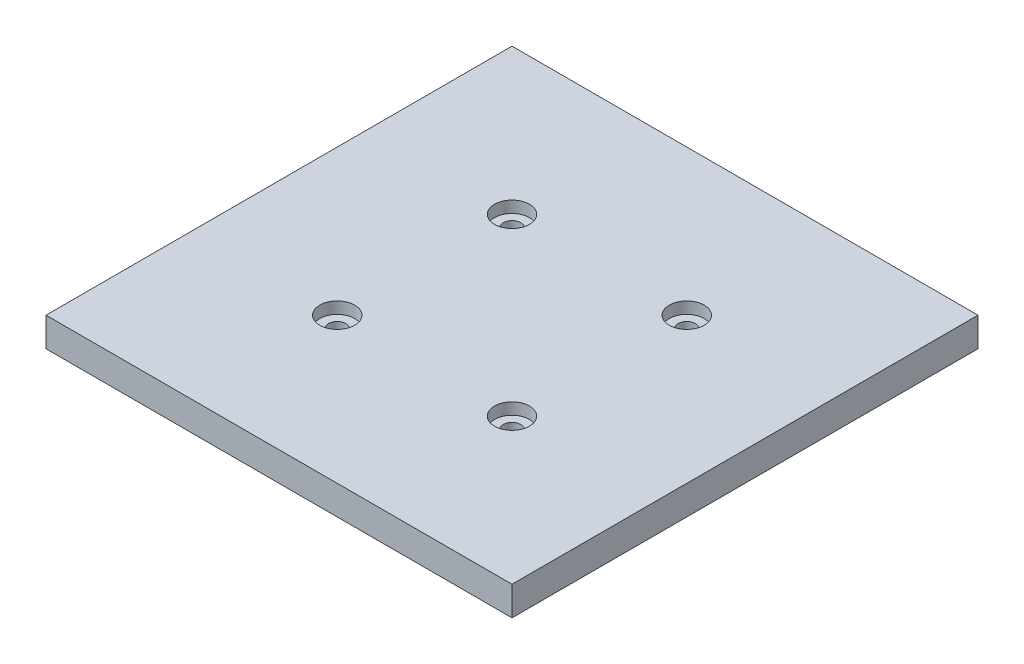
ISO-10303-21;
HEADER;
FILE_DESCRIPTION(('STEP AP214'),'2;1');
FILE_NAME('part.step','',(''),(''),'','','');
FILE_SCHEMA(('AUTOMOTIVE_DESIGN { 1 0 10303 214 1 1 1 1 }'));
ENDSEC;
DATA;
#1=APPLICATION_CONTEXT('core data for automotive mechanical design processes');
#2=APPLICATION_PROTOCOL_DEFINITION('international standard','automotive_design',2000,#1);
#3=PRODUCT_CONTEXT('',#1,'mechanical');
#4=PRODUCT('Part','Part','',(#3));
#5=PRODUCT_RELATED_PRODUCT_CATEGORY('part','',(#4));
#6=PRODUCT_DEFINITION_FORMATION('','',#4);
#7=PRODUCT_DEFINITION_CONTEXT('part definition',#1,'design');
#8=PRODUCT_DEFINITION('design','',#6,#7);
#9=PRODUCT_DEFINITION_SHAPE('','',#8);
#10=(LENGTH_UNIT() NAMED_UNIT(*) SI_UNIT(.MILLI.,.METRE.));
#11=(NAMED_UNIT(*) PLANE_ANGLE_UNIT() SI_UNIT($,.RADIAN.));
#12=(NAMED_UNIT(*) SI_UNIT($,.STERADIAN.) SOLID_ANGLE_UNIT());
#13=UNCERTAINTY_MEASURE_WITH_UNIT(LENGTH_MEASURE(1.E-05),#10,'distance_accuracy_value','');
#14=(GEOMETRIC_REPRESENTATION_CONTEXT(3) GLOBAL_UNCERTAINTY_ASSIGNED_CONTEXT((#13)) GLOBAL_UNIT_ASSIGNED_CONTEXT((#10,
#11,#12)) REPRESENTATION_CONTEXT('',''));
#15=CARTESIAN_POINT('',(0.,0.,0.));
#16=DIRECTION('',(0.,0.,1.));
#17=DIRECTION('',(1.,0.,0.));
#18=AXIS2_PLACEMENT_3D('',#15,#16,#17);
#19=CARTESIAN_POINT('',(15.,5.,15.));
#20=DIRECTION('',(0.,-1.,0.));
#21=DIRECTION('',(0.,0.,-1.));
#22=AXIS2_PLACEMENT_3D('',#19,#20,#21);
#23=CYLINDRICAL_SURFACE('',#22,1.5);
#24=CARTESIAN_POINT('',(15.,0.,15.));
#25=DIRECTION('',(0.,1.,0.));
#26=DIRECTION('',(0.,0.,1.));
#27=AXIS2_PLACEMENT_3D('',#24,#25,#26);
#28=CIRCLE('',#27,1.5);
#29=CARTESIAN_POINT('',(15.,0.,16.5));
#30=VERTEX_POINT('',#29);
#31=EDGE_CURVE('E111',#30,#30,#28,.T.);
#32=ORIENTED_EDGE('',*,*,#31,.F.);
#33=EDGE_LOOP('',(#32));
#34=FACE_BOUND('',#33,.T.);
#35=CARTESIAN_POINT('',(15.,3.,15.));
#36=DIRECTION('',(0.,1.,0.));
#37=DIRECTION('',(0.,0.,1.));
#38=AXIS2_PLACEMENT_3D('',#35,#36,#37);
#39=CIRCLE('',#38,1.5);
#40=CARTESIAN_POINT('',(15.,3.,16.5));
#41=VERTEX_POINT('',#40);
#42=EDGE_CURVE('E117',#41,#41,#39,.T.);
#43=ORIENTED_EDGE('',*,*,#42,.T.);
#44=EDGE_LOOP('',(#43));
#45=FACE_BOUND('',#44,.T.);
#46=ADVANCED_FACE('F32',(#34,#45),#23,.F.);
#47=CARTESIAN_POINT('',(-15.,5.,-15.));
#48=DIRECTION('',(0.,-1.,0.));
#49=DIRECTION('',(0.,0.,-1.));
#50=AXIS2_PLACEMENT_3D('',#47,#48,#49);
#51=CYLINDRICAL_SURFACE('',#50,1.5);
#52=CARTESIAN_POINT('',(-15.,0.,-15.));
#53=DIRECTION('',(0.,1.,0.));
#54=DIRECTION('',(0.,0.,1.));
#55=AXIS2_PLACEMENT_3D('',#52,#53,#54);
#56=CIRCLE('',#55,1.5);
#57=CARTESIAN_POINT('',(-15.,0.,-13.5));
#58=VERTEX_POINT('',#57);
#59=EDGE_CURVE('E102',#58,#58,#56,.T.);
#60=ORIENTED_EDGE('',*,*,#59,.F.);
#61=EDGE_LOOP('',(#60));
#62=FACE_BOUND('',#61,.T.);
#63=CARTESIAN_POINT('',(-15.,3.,-15.));
#64=DIRECTION('',(0.,1.,0.));
#65=DIRECTION('',(0.,0.,1.));
#66=AXIS2_PLACEMENT_3D('',#63,#64,#65);
#67=CIRCLE('',#66,1.5);
#68=CARTESIAN_POINT('',(-15.,3.,-13.5));
#69=VERTEX_POINT('',#68);
#70=EDGE_CURVE('E108',#69,#69,#67,.T.);
#71=ORIENTED_EDGE('',*,*,#70,.T.);
#72=EDGE_LOOP('',(#71));
#73=FACE_BOUND('',#72,.T.);
#74=ADVANCED_FACE('F156',(#62,#73),#51,.F.);
#75=CARTESIAN_POINT('',(-40.,5.,40.));
#76=DIRECTION('',(0.,1.,0.));
#77=DIRECTION('',(0.,0.,1.));
#78=AXIS2_PLACEMENT_3D('',#75,#76,#77);
#79=PLANE('',#78);
#80=CARTESIAN_POINT('',(-15.,5.,15.));
#81=DIRECTION('',(0.,1.,0.));
#82=DIRECTION('',(0.,0.,-1.));
#83=AXIS2_PLACEMENT_3D('',#80,#81,#82);
#84=CIRCLE('',#83,3.);
#85=CARTESIAN_POINT('',(-15.,5.,12.));
#86=VERTEX_POINT('',#85);
#87=EDGE_CURVE('E133',#86,#86,#84,.T.);
#88=ORIENTED_EDGE('',*,*,#87,.F.);
#89=EDGE_LOOP('',(#88));
#90=FACE_BOUND('',#89,.T.);
#91=CARTESIAN_POINT('',(15.,5.,15.));
#92=DIRECTION('',(0.,1.,0.));
#93=DIRECTION('',(0.,0.,1.));
#94=AXIS2_PLACEMENT_3D('',#91,#92,#93);
#95=CIRCLE('',#94,3.);
#96=CARTESIAN_POINT('',(15.,5.,18.));
#97=VERTEX_POINT('',#96);
#98=EDGE_CURVE('E126',#97,#97,#95,.T.);
#99=ORIENTED_EDGE('',*,*,#98,.F.);
#100=EDGE_LOOP('',(#99));
#101=FACE_BOUND('',#100,.T.);
#102=CARTESIAN_POINT('',(15.,5.,-15.));
#103=DIRECTION('',(0.,1.,0.));
#104=DIRECTION('',(0.,0.,-1.));
#105=AXIS2_PLACEMENT_3D('',#102,#103,#104);
#106=CIRCLE('',#105,3.);
#107=CARTESIAN_POINT('',(15.,5.,-18.));
#108=VERTEX_POINT('',#107);
#109=EDGE_CURVE('E119',#108,#108,#106,.T.);
#110=ORIENTED_EDGE('',*,*,#109,.F.);
#111=EDGE_LOOP('',(#110));
#112=FACE_BOUND('',#111,.T.);
#113=CARTESIAN_POINT('',(-15.,5.,-15.));
#114=DIRECTION('',(0.,1.,0.));
#115=DIRECTION('',(0.,0.,1.));
#116=AXIS2_PLACEMENT_3D('',#113,#114,#115);
#117=CIRCLE('',#116,3.);
#118=CARTESIAN_POINT('',(-15.,5.,-12.));
#119=VERTEX_POINT('',#118);
#120=EDGE_CURVE('E115',#119,#119,#117,.T.);
#121=ORIENTED_EDGE('',*,*,#120,.F.);
#122=EDGE_LOOP('',(#121));
#123=FACE_BOUND('',#122,.T.);
#124=DIRECTION('',(0.,0.,1.));
#125=VECTOR('',#124,1.);
#126=CARTESIAN_POINT('',(-40.,5.,-40.));
#127=LINE('',#126,#125);
#128=CARTESIAN_POINT('',(-40.,5.,-40.));
#129=VERTEX_POINT('',#128);
#130=CARTESIAN_POINT('',(-40.,5.,40.));
#131=VERTEX_POINT('',#130);
#132=EDGE_CURVE('E86',#129,#131,#127,.T.);
#133=ORIENTED_EDGE('',*,*,#132,.T.);
#134=DIRECTION('',(1.,0.,0.));
#135=VECTOR('',#134,1.);
#136=CARTESIAN_POINT('',(-40.,5.,40.));
#137=LINE('',#136,#135);
#138=CARTESIAN_POINT('',(40.,5.,40.));
#139=VERTEX_POINT('',#138);
#140=EDGE_CURVE('E81',#131,#139,#137,.T.);
#141=ORIENTED_EDGE('',*,*,#140,.T.);
#142=DIRECTION('',(0.,0.,-1.));
#143=VECTOR('',#142,1.);
#144=CARTESIAN_POINT('',(40.,5.,-40.));
#145=LINE('',#144,#143);
#146=CARTESIAN_POINT('',(40.,5.,-40.));
#147=VERTEX_POINT('',#146);
#148=EDGE_CURVE('E84',#139,#147,#145,.T.);
#149=ORIENTED_EDGE('',*,*,#148,.T.);
#150=DIRECTION('',(-1.,0.,0.));
#151=VECTOR('',#150,1.);
#152=CARTESIAN_POINT('',(-40.,5.,-40.));
#153=LINE('',#152,#151);
#154=EDGE_CURVE('E51',#147,#129,#153,.T.);
#155=ORIENTED_EDGE('',*,*,#154,.T.);
#156=EDGE_LOOP('',(#133,#141,#149,#155));
#157=FACE_BOUND('',#156,.T.);
#158=ADVANCED_FACE('F82',(#90,#101,#112,#123,#157),#79,.T.);
#159=CARTESIAN_POINT('',(-40.,0.,40.));
#160=DIRECTION('',(0.,1.,0.));
#161=DIRECTION('',(0.,0.,1.));
#162=AXIS2_PLACEMENT_3D('',#159,#160,#161);
#163=PLANE('',#162);
#164=CARTESIAN_POINT('',(-15.,0.,15.));
#165=DIRECTION('',(0.,1.,0.));
#166=DIRECTION('',(0.,0.,-1.));
#167=AXIS2_PLACEMENT_3D('',#164,#165,#166);
#168=CIRCLE('',#167,1.5);
#169=CARTESIAN_POINT('',(-15.,0.,13.5));
#170=VERTEX_POINT('',#169);
#171=EDGE_CURVE('E144',#170,#170,#168,.T.);
#172=ORIENTED_EDGE('',*,*,#171,.T.);
#173=EDGE_LOOP('',(#172));
#174=FACE_BOUND('',#173,.T.);
#175=ORIENTED_EDGE('',*,*,#59,.T.);
#176=EDGE_LOOP('',(#175));
#177=FACE_BOUND('',#176,.T.);
#178=DIRECTION('',(0.,0.,1.));
#179=VECTOR('',#178,1.);
#180=CARTESIAN_POINT('',(-40.,0.,-40.));
#181=LINE('',#180,#179);
#182=CARTESIAN_POINT('',(-40.,0.,-40.));
#183=VERTEX_POINT('',#182);
#184=CARTESIAN_POINT('',(-40.,0.,40.));
#185=VERTEX_POINT('',#184);
#186=EDGE_CURVE('E99',#183,#185,#181,.T.);
#187=ORIENTED_EDGE('',*,*,#186,.F.);
#188=DIRECTION('',(-1.,0.,0.));
#189=VECTOR('',#188,1.);
#190=CARTESIAN_POINT('',(-40.,0.,-40.));
#191=LINE('',#190,#189);
#192=CARTESIAN_POINT('',(40.,0.,-40.));
#193=VERTEX_POINT('',#192);
#194=EDGE_CURVE('E74',#193,#183,#191,.T.);
#195=ORIENTED_EDGE('',*,*,#194,.F.);
#196=DIRECTION('',(0.,0.,-1.));
#197=VECTOR('',#196,1.);
#198=CARTESIAN_POINT('',(40.,0.,-40.));
#199=LINE('',#198,#197);
#200=CARTESIAN_POINT('',(40.,0.,40.));
#201=VERTEX_POINT('',#200);
#202=EDGE_CURVE('E68',#201,#193,#199,.T.);
#203=ORIENTED_EDGE('',*,*,#202,.F.);
#204=DIRECTION('',(1.,0.,0.));
#205=VECTOR('',#204,1.);
#206=CARTESIAN_POINT('',(-40.,0.,40.));
#207=LINE('',#206,#205);
#208=EDGE_CURVE('E90',#185,#201,#207,.T.);
#209=ORIENTED_EDGE('',*,*,#208,.F.);
#210=EDGE_LOOP('',(#187,#195,#203,#209));
#211=FACE_BOUND('',#210,.T.);
#212=CARTESIAN_POINT('',(15.,0.,-15.));
#213=DIRECTION('',(0.,1.,0.));
#214=DIRECTION('',(0.,0.,-1.));
#215=AXIS2_PLACEMENT_3D('',#212,#213,#214);
#216=CIRCLE('',#215,1.5);
#217=CARTESIAN_POINT('',(15.,0.,-16.5));
#218=VERTEX_POINT('',#217);
#219=EDGE_CURVE('E147',#218,#218,#216,.T.);
#220=ORIENTED_EDGE('',*,*,#219,.T.);
#221=EDGE_LOOP('',(#220));
#222=FACE_BOUND('',#221,.T.);
#223=ORIENTED_EDGE('',*,*,#31,.T.);
#224=EDGE_LOOP('',(#223));
#225=FACE_BOUND('',#224,.T.);
#226=ADVANCED_FACE('F153',(#174,#177,#211,#222,#225),#163,.F.);
#227=CARTESIAN_POINT('',(-40.,5.,-40.));
#228=DIRECTION('',(1.,0.,0.));
#229=DIRECTION('',(0.,0.,-1.));
#230=AXIS2_PLACEMENT_3D('',#227,#228,#229);
#231=PLANE('',#230);
#232=ORIENTED_EDGE('',*,*,#186,.T.);
#233=DIRECTION('',(0.,-1.,0.));
#234=VECTOR('',#233,1.);
#235=CARTESIAN_POINT('',(-40.,5.,40.));
#236=LINE('',#235,#234);
#237=EDGE_CURVE('E11',#131,#185,#236,.T.);
#238=ORIENTED_EDGE('',*,*,#237,.F.);
#239=ORIENTED_EDGE('',*,*,#132,.F.);
#240=DIRECTION('',(0.,-1.,0.));
#241=VECTOR('',#240,1.);
#242=CARTESIAN_POINT('',(-40.,5.,-40.));
#243=LINE('',#242,#241);
#244=EDGE_CURVE('E95',#129,#183,#243,.T.);
#245=ORIENTED_EDGE('',*,*,#244,.T.);
#246=EDGE_LOOP('',(#232,#238,#239,#245));
#247=FACE_BOUND('',#246,.T.);
#248=ADVANCED_FACE('F34',(#247),#231,.F.);
#249=CARTESIAN_POINT('',(-40.,5.,40.));
#250=DIRECTION('',(0.,0.,-1.));
#251=DIRECTION('',(-1.,0.,0.));
#252=AXIS2_PLACEMENT_3D('',#249,#250,#251);
#253=PLANE('',#252);
#254=ORIENTED_EDGE('',*,*,#208,.T.);
#255=DIRECTION('',(0.,-1.,0.));
#256=VECTOR('',#255,1.);
#257=CARTESIAN_POINT('',(40.,5.,40.));
#258=LINE('',#257,#256);
#259=EDGE_CURVE('E42',#139,#201,#258,.T.);
#260=ORIENTED_EDGE('',*,*,#259,.F.);
#261=ORIENTED_EDGE('',*,*,#140,.F.);
#262=ORIENTED_EDGE('',*,*,#237,.T.);
#263=EDGE_LOOP('',(#254,#260,#261,#262));
#264=FACE_BOUND('',#263,.T.);
#265=ADVANCED_FACE('F89',(#264),#253,.F.);
#266=CARTESIAN_POINT('',(40.,5.,-40.));
#267=DIRECTION('',(-1.,0.,0.));
#268=DIRECTION('',(0.,0.,1.));
#269=AXIS2_PLACEMENT_3D('',#266,#267,#268);
#270=PLANE('',#269);
#271=ORIENTED_EDGE('',*,*,#202,.T.);
#272=DIRECTION('',(0.,-1.,0.));
#273=VECTOR('',#272,1.);
#274=CARTESIAN_POINT('',(40.,5.,-40.));
#275=LINE('',#274,#273);
#276=EDGE_CURVE('E91',#147,#193,#275,.T.);
#277=ORIENTED_EDGE('',*,*,#276,.F.);
#278=ORIENTED_EDGE('',*,*,#148,.F.);
#279=ORIENTED_EDGE('',*,*,#259,.T.);
#280=EDGE_LOOP('',(#271,#277,#278,#279));
#281=FACE_BOUND('',#280,.T.);
#282=ADVANCED_FACE('F93',(#281),#270,.F.);
#283=CARTESIAN_POINT('',(-40.,5.,-40.));
#284=DIRECTION('',(0.,0.,1.));
#285=DIRECTION('',(1.,0.,0.));
#286=AXIS2_PLACEMENT_3D('',#283,#284,#285);
#287=PLANE('',#286);
#288=ORIENTED_EDGE('',*,*,#194,.T.);
#289=ORIENTED_EDGE('',*,*,#244,.F.);
#290=ORIENTED_EDGE('',*,*,#154,.F.);
#291=ORIENTED_EDGE('',*,*,#276,.T.);
#292=EDGE_LOOP('',(#288,#289,#290,#291));
#293=FACE_BOUND('',#292,.T.);
#294=ADVANCED_FACE('F198',(#293),#287,.F.);
#295=CARTESIAN_POINT('',(15.,5.,-15.));
#296=DIRECTION('',(0.,-1.,0.));
#297=DIRECTION('',(0.,0.,-1.));
#298=AXIS2_PLACEMENT_3D('',#295,#296,#297);
#299=CYLINDRICAL_SURFACE('',#298,1.5);
#300=CARTESIAN_POINT('',(15.,3.,-15.));
#301=DIRECTION('',(0.,-1.,0.));
#302=DIRECTION('',(0.,0.,-1.));
#303=AXIS2_PLACEMENT_3D('',#300,#301,#302);
#304=CIRCLE('',#303,1.5);
#305=CARTESIAN_POINT('',(15.,3.,-16.5));
#306=VERTEX_POINT('',#305);
#307=EDGE_CURVE('E113',#306,#306,#304,.T.);
#308=ORIENTED_EDGE('',*,*,#307,.F.);
#309=EDGE_LOOP('',(#308));
#310=FACE_BOUND('',#309,.T.);
#311=ORIENTED_EDGE('',*,*,#219,.F.);
#312=EDGE_LOOP('',(#311));
#313=FACE_BOUND('',#312,.T.);
#314=ADVANCED_FACE('F195',(#310,#313),#299,.F.);
#315=CARTESIAN_POINT('',(-15.,5.,15.));
#316=DIRECTION('',(0.,-1.,0.));
#317=DIRECTION('',(0.,0.,-1.));
#318=AXIS2_PLACEMENT_3D('',#315,#316,#317);
#319=CYLINDRICAL_SURFACE('',#318,1.5);
#320=CARTESIAN_POINT('',(-15.,3.,15.));
#321=DIRECTION('',(0.,-1.,0.));
#322=DIRECTION('',(0.,0.,-1.));
#323=AXIS2_PLACEMENT_3D('',#320,#321,#322);
#324=CIRCLE('',#323,1.5);
#325=CARTESIAN_POINT('',(-15.,3.,13.5));
#326=VERTEX_POINT('',#325);
#327=EDGE_CURVE('E36',#326,#326,#324,.T.);
#328=ORIENTED_EDGE('',*,*,#327,.F.);
#329=EDGE_LOOP('',(#328));
#330=FACE_BOUND('',#329,.T.);
#331=ORIENTED_EDGE('',*,*,#171,.F.);
#332=EDGE_LOOP('',(#331));
#333=FACE_BOUND('',#332,.T.);
#334=ADVANCED_FACE('F172',(#330,#333),#319,.F.);
#335=CARTESIAN_POINT('',(-15.,3.,-15.));
#336=DIRECTION('',(0.,1.,0.));
#337=DIRECTION('',(0.,0.,1.));
#338=AXIS2_PLACEMENT_3D('',#335,#336,#337);
#339=CYLINDRICAL_SURFACE('',#338,3.);
#340=CARTESIAN_POINT('',(-15.,3.,-15.));
#341=DIRECTION('',(0.,1.,0.));
#342=DIRECTION('',(0.,0.,1.));
#343=AXIS2_PLACEMENT_3D('',#340,#341,#342);
#344=CIRCLE('',#343,3.);
#345=CARTESIAN_POINT('',(-15.,3.,-12.));
#346=VERTEX_POINT('',#345);
#347=EDGE_CURVE('E112',#346,#346,#344,.T.);
#348=ORIENTED_EDGE('',*,*,#347,.F.);
#349=EDGE_LOOP('',(#348));
#350=FACE_BOUND('',#349,.T.);
#351=ORIENTED_EDGE('',*,*,#120,.T.);
#352=EDGE_LOOP('',(#351));
#353=FACE_BOUND('',#352,.T.);
#354=ADVANCED_FACE('F166',(#350,#353),#339,.F.);
#355=CARTESIAN_POINT('',(-15.,3.,-15.));
#356=DIRECTION('',(0.,1.,0.));
#357=DIRECTION('',(0.,0.,1.));
#358=AXIS2_PLACEMENT_3D('',#355,#356,#357);
#359=PLANE('',#358);
#360=ORIENTED_EDGE('',*,*,#70,.F.);
#361=EDGE_LOOP('',(#360));
#362=FACE_BOUND('',#361,.T.);
#363=ORIENTED_EDGE('',*,*,#347,.T.);
#364=EDGE_LOOP('',(#363));
#365=FACE_BOUND('',#364,.T.);
#366=ADVANCED_FACE('F162',(#362,#365),#359,.T.);
#367=CARTESIAN_POINT('',(15.,3.,-15.));
#368=DIRECTION('',(0.,1.,0.));
#369=DIRECTION('',(0.,0.,1.));
#370=AXIS2_PLACEMENT_3D('',#367,#368,#369);
#371=CYLINDRICAL_SURFACE('',#370,3.);
#372=CARTESIAN_POINT('',(15.,3.,-15.));
#373=DIRECTION('',(0.,1.,0.));
#374=DIRECTION('',(0.,0.,-1.));
#375=AXIS2_PLACEMENT_3D('',#372,#373,#374);
#376=CIRCLE('',#375,3.);
#377=CARTESIAN_POINT('',(15.,3.,-18.));
#378=VERTEX_POINT('',#377);
#379=EDGE_CURVE('E116',#378,#378,#376,.T.);
#380=ORIENTED_EDGE('',*,*,#379,.F.);
#381=EDGE_LOOP('',(#380));
#382=FACE_BOUND('',#381,.T.);
#383=ORIENTED_EDGE('',*,*,#109,.T.);
#384=EDGE_LOOP('',(#383));
#385=FACE_BOUND('',#384,.T.);
#386=ADVANCED_FACE('F165',(#382,#385),#371,.F.);
#387=CARTESIAN_POINT('',(15.,3.,-15.));
#388=DIRECTION('',(0.,-1.,0.));
#389=DIRECTION('',(0.,0.,-1.));
#390=AXIS2_PLACEMENT_3D('',#387,#388,#389);
#391=PLANE('',#390);
#392=ORIENTED_EDGE('',*,*,#307,.T.);
#393=EDGE_LOOP('',(#392));
#394=FACE_BOUND('',#393,.T.);
#395=ORIENTED_EDGE('',*,*,#379,.T.);
#396=EDGE_LOOP('',(#395));
#397=FACE_BOUND('',#396,.T.);
#398=ADVANCED_FACE('F210',(#394,#397),#391,.F.);
#399=CARTESIAN_POINT('',(15.,3.,15.));
#400=DIRECTION('',(0.,1.,0.));
#401=DIRECTION('',(0.,0.,1.));
#402=AXIS2_PLACEMENT_3D('',#399,#400,#401);
#403=CYLINDRICAL_SURFACE('',#402,3.);
#404=CARTESIAN_POINT('',(15.,3.,15.));
#405=DIRECTION('',(0.,1.,0.));
#406=DIRECTION('',(0.,0.,1.));
#407=AXIS2_PLACEMENT_3D('',#404,#405,#406);
#408=CIRCLE('',#407,3.);
#409=CARTESIAN_POINT('',(15.,3.,18.));
#410=VERTEX_POINT('',#409);
#411=EDGE_CURVE('E120',#410,#410,#408,.T.);
#412=ORIENTED_EDGE('',*,*,#411,.F.);
#413=EDGE_LOOP('',(#412));
#414=FACE_BOUND('',#413,.T.);
#415=ORIENTED_EDGE('',*,*,#98,.T.);
#416=EDGE_LOOP('',(#415));
#417=FACE_BOUND('',#416,.T.);
#418=ADVANCED_FACE('F213',(#414,#417),#403,.F.);
#419=CARTESIAN_POINT('',(15.,3.,15.));
#420=DIRECTION('',(0.,1.,0.));
#421=DIRECTION('',(0.,0.,1.));
#422=AXIS2_PLACEMENT_3D('',#419,#420,#421);
#423=PLANE('',#422);
#424=ORIENTED_EDGE('',*,*,#42,.F.);
#425=EDGE_LOOP('',(#424));
#426=FACE_BOUND('',#425,.T.);
#427=ORIENTED_EDGE('',*,*,#411,.T.);
#428=EDGE_LOOP('',(#427));
#429=FACE_BOUND('',#428,.T.);
#430=ADVANCED_FACE('F227',(#426,#429),#423,.T.);
#431=CARTESIAN_POINT('',(-15.,3.,15.));
#432=DIRECTION('',(0.,1.,0.));
#433=DIRECTION('',(0.,0.,1.));
#434=AXIS2_PLACEMENT_3D('',#431,#432,#433);
#435=CYLINDRICAL_SURFACE('',#434,3.);
#436=CARTESIAN_POINT('',(-15.,3.,15.));
#437=DIRECTION('',(0.,1.,0.));
#438=DIRECTION('',(0.,0.,-1.));
#439=AXIS2_PLACEMENT_3D('',#436,#437,#438);
#440=CIRCLE('',#439,3.);
#441=CARTESIAN_POINT('',(-15.,3.,12.));
#442=VERTEX_POINT('',#441);
#443=EDGE_CURVE('E246',#442,#442,#440,.T.);
#444=ORIENTED_EDGE('',*,*,#443,.F.);
#445=EDGE_LOOP('',(#444));
#446=FACE_BOUND('',#445,.T.);
#447=ORIENTED_EDGE('',*,*,#87,.T.);
#448=EDGE_LOOP('',(#447));
#449=FACE_BOUND('',#448,.T.);
#450=ADVANCED_FACE('F231',(#446,#449),#435,.F.);
#451=CARTESIAN_POINT('',(-15.,3.,15.));
#452=DIRECTION('',(0.,-1.,0.));
#453=DIRECTION('',(0.,0.,-1.));
#454=AXIS2_PLACEMENT_3D('',#451,#452,#453);
#455=PLANE('',#454);
#456=ORIENTED_EDGE('',*,*,#327,.T.);
#457=EDGE_LOOP('',(#456));
#458=FACE_BOUND('',#457,.T.);
#459=ORIENTED_EDGE('',*,*,#443,.T.);
#460=EDGE_LOOP('',(#459));
#461=FACE_BOUND('',#460,.T.);
#462=ADVANCED_FACE('F235',(#458,#461),#455,.F.);
#463=CLOSED_SHELL('',(#46,#74,#158,#226,#248,#265,#282,#294,#314,#334,#354,#366,#386,#398,#418,
#430,#450,#462));
#464=MANIFOLD_SOLID_BREP('B2',#463);
#465=ADVANCED_BREP_SHAPE_REPRESENTATION('',(#18,#464),#14);
#466=SHAPE_DEFINITION_REPRESENTATION(#9,#465);
ENDSEC;
END-ISO-10303-21;
